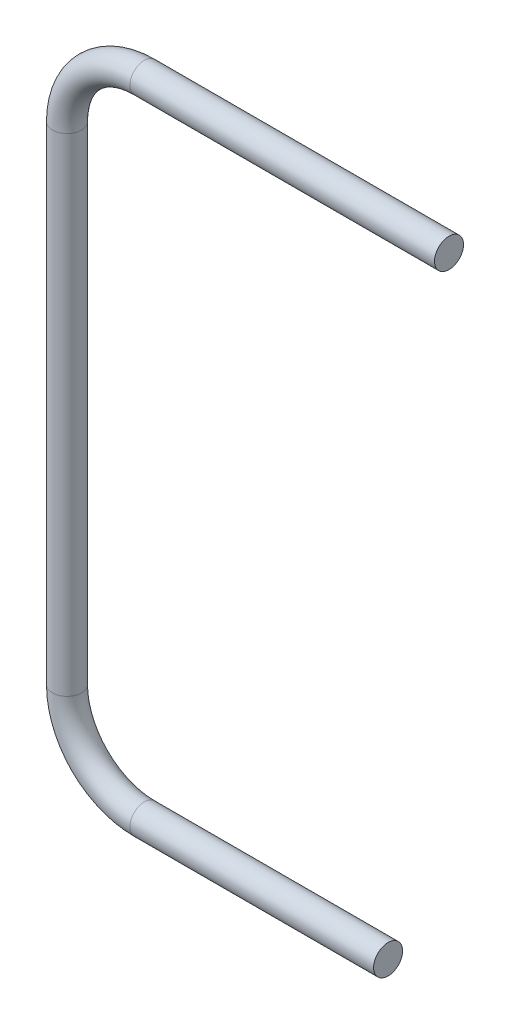
ISO-10303-21;
HEADER;
FILE_DESCRIPTION(('STEP AP214'),'2;1');
FILE_NAME('part.step','',(''),(''),'','','');
FILE_SCHEMA(('AUTOMOTIVE_DESIGN { 1 0 10303 214 1 1 1 1 }'));
ENDSEC;
DATA;
#1=APPLICATION_CONTEXT('core data for automotive mechanical design processes');
#2=APPLICATION_PROTOCOL_DEFINITION('international standard','automotive_design',2000,#1);
#3=PRODUCT_CONTEXT('',#1,'mechanical');
#4=PRODUCT('Part','Part','',(#3));
#5=PRODUCT_RELATED_PRODUCT_CATEGORY('part','',(#4));
#6=PRODUCT_DEFINITION_FORMATION('','',#4);
#7=PRODUCT_DEFINITION_CONTEXT('part definition',#1,'design');
#8=PRODUCT_DEFINITION('design','',#6,#7);
#9=PRODUCT_DEFINITION_SHAPE('','',#8);
#10=(LENGTH_UNIT() NAMED_UNIT(*) SI_UNIT(.MILLI.,.METRE.));
#11=(NAMED_UNIT(*) PLANE_ANGLE_UNIT() SI_UNIT($,.RADIAN.));
#12=(NAMED_UNIT(*) SI_UNIT($,.STERADIAN.) SOLID_ANGLE_UNIT());
#13=UNCERTAINTY_MEASURE_WITH_UNIT(LENGTH_MEASURE(1.E-05),#10,'distance_accuracy_value','');
#14=(GEOMETRIC_REPRESENTATION_CONTEXT(3) GLOBAL_UNCERTAINTY_ASSIGNED_CONTEXT((#13)) GLOBAL_UNIT_ASSIGNED_CONTEXT((#10,
#11,#12)) REPRESENTATION_CONTEXT('',''));
#15=CARTESIAN_POINT('',(0.,0.,0.));
#16=DIRECTION('',(0.,0.,1.));
#17=DIRECTION('',(1.,0.,0.));
#18=AXIS2_PLACEMENT_3D('',#15,#16,#17);
#19=CARTESIAN_POINT('',(0.,0.,0.));
#20=DIRECTION('',(1.,0.,0.));
#21=DIRECTION('',(0.,0.,1.));
#22=AXIS2_PLACEMENT_3D('',#19,#20,#21);
#23=PLANE('',#22);
#24=CARTESIAN_POINT('',(0.,0.,0.));
#25=DIRECTION('',(1.,0.,0.));
#26=DIRECTION('',(0.,0.,1.));
#27=AXIS2_PLACEMENT_3D('',#24,#25,#26);
#28=CIRCLE('',#27,2.38125);
#29=CARTESIAN_POINT('',(0.,0.,2.38125));
#30=VERTEX_POINT('',#29);
#31=EDGE_CURVE('E76',#30,#30,#28,.T.);
#32=ORIENTED_EDGE('',*,*,#31,.T.);
#33=EDGE_LOOP('',(#32));
#34=FACE_BOUND('',#33,.T.);
#35=ADVANCED_FACE('F49',(#34),#23,.T.);
#36=CARTESIAN_POINT('',(9.99999999999999,105.4,0.));
#37=DIRECTION('',(-1.,0.,0.));
#38=DIRECTION('',(0.,0.,1.));
#39=AXIS2_PLACEMENT_3D('',#36,#37,#38);
#40=PLANE('',#39);
#41=CARTESIAN_POINT('',(9.99999999999999,105.4,0.));
#42=DIRECTION('',(-1.,0.,0.));
#43=DIRECTION('',(0.,0.,1.));
#44=AXIS2_PLACEMENT_3D('',#41,#42,#43);
#45=CIRCLE('',#44,2.38125);
#46=CARTESIAN_POINT('',(9.99999999999999,105.4,2.38125));
#47=VERTEX_POINT('',#46);
#48=EDGE_CURVE('E11',#47,#47,#45,.T.);
#49=ORIENTED_EDGE('',*,*,#48,.F.);
#50=EDGE_LOOP('',(#49));
#51=FACE_BOUND('',#50,.T.);
#52=ADVANCED_FACE('F85',(#51),#40,.F.);
#53=CARTESIAN_POINT('',(0.,0.,0.));
#54=DIRECTION('',(-1.,0.,0.));
#55=DIRECTION('',(0.,-1.,0.));
#56=AXIS2_PLACEMENT_3D('',#53,#54,#55);
#57=CYLINDRICAL_SURFACE('',#56,2.38125);
#58=CARTESIAN_POINT('',(-40.,0.,0.));
#59=DIRECTION('',(1.,0.,0.));
#60=DIRECTION('',(0.,0.,1.));
#61=AXIS2_PLACEMENT_3D('',#58,#59,#60);
#62=CIRCLE('',#61,2.38125);
#63=CARTESIAN_POINT('',(-40.,-2.38125000000001,0.));
#64=VERTEX_POINT('',#63);
#65=EDGE_CURVE('E72',#64,#64,#62,.T.);
#66=ORIENTED_EDGE('',*,*,#65,.T.);
#67=EDGE_LOOP('',(#66));
#68=FACE_BOUND('',#67,.T.);
#69=ORIENTED_EDGE('',*,*,#31,.F.);
#70=EDGE_LOOP('',(#69));
#71=FACE_BOUND('',#70,.T.);
#72=ADVANCED_FACE('F82',(#68,#71),#57,.T.);
#73=CARTESIAN_POINT('',(-40.,12.7,0.));
#74=DIRECTION('',(0.,0.,-1.));
#75=DIRECTION('',(-1.,0.,0.));
#76=AXIS2_PLACEMENT_3D('',#73,#74,#75);
#77=TOROIDAL_SURFACE('',#76,12.7,2.38125);
#78=CARTESIAN_POINT('',(-52.7,12.7,0.));
#79=DIRECTION('',(0.,-1.,0.));
#80=DIRECTION('',(0.,0.,1.));
#81=AXIS2_PLACEMENT_3D('',#78,#79,#80);
#82=CIRCLE('',#81,2.38125);
#83=CARTESIAN_POINT('',(-55.08125,12.7,0.));
#84=VERTEX_POINT('',#83);
#85=EDGE_CURVE('E66',#84,#84,#82,.T.);
#86=CARTESIAN_POINT('',(-40.,12.7,0.));
#87=DIRECTION('',(0.,0.,-1.));
#88=DIRECTION('',(-1.,0.,0.));
#89=AXIS2_PLACEMENT_3D('',#86,#87,#88);
#90=CIRCLE('',#89,15.08125);
#91=EDGE_CURVE('',#64,#84,#90,.T.);
#92=ORIENTED_EDGE('',*,*,#65,.F.);
#93=ORIENTED_EDGE('',*,*,#85,.T.);
#94=ORIENTED_EDGE('',*,*,#91,.T.);
#95=ORIENTED_EDGE('',*,*,#91,.F.);
#96=EDGE_LOOP('',(#92,#94,#93,#95));
#97=FACE_BOUND('',#96,.T.);
#98=ADVANCED_FACE('F84',(#97),#77,.T.);
#99=CARTESIAN_POINT('',(-52.7,12.7,0.));
#100=DIRECTION('',(0.,1.,0.));
#101=DIRECTION('',(-1.,0.,0.));
#102=AXIS2_PLACEMENT_3D('',#99,#100,#101);
#103=CYLINDRICAL_SURFACE('',#102,2.38125);
#104=CARTESIAN_POINT('',(-52.7,92.7,0.));
#105=DIRECTION('',(0.,-1.,0.));
#106=DIRECTION('',(0.,0.,1.));
#107=AXIS2_PLACEMENT_3D('',#104,#105,#106);
#108=CIRCLE('',#107,2.38125);
#109=CARTESIAN_POINT('',(-55.08125,92.7,0.));
#110=VERTEX_POINT('',#109);
#111=EDGE_CURVE('E61',#110,#110,#108,.T.);
#112=ORIENTED_EDGE('',*,*,#111,.T.);
#113=EDGE_LOOP('',(#112));
#114=FACE_BOUND('',#113,.T.);
#115=ORIENTED_EDGE('',*,*,#85,.F.);
#116=EDGE_LOOP('',(#115));
#117=FACE_BOUND('',#116,.T.);
#118=ADVANCED_FACE('F92',(#114,#117),#103,.T.);
#119=CARTESIAN_POINT('',(-40.,92.7,0.));
#120=DIRECTION('',(0.,0.,-1.));
#121=DIRECTION('',(-1.,0.,0.));
#122=AXIS2_PLACEMENT_3D('',#119,#120,#121);
#123=TOROIDAL_SURFACE('',#122,12.7,2.38125);
#124=CARTESIAN_POINT('',(-40.,105.4,0.));
#125=DIRECTION('',(-1.,0.,0.));
#126=DIRECTION('',(0.,0.,1.));
#127=AXIS2_PLACEMENT_3D('',#124,#125,#126);
#128=CIRCLE('',#127,2.38125);
#129=CARTESIAN_POINT('',(-40.,107.78125,0.));
#130=VERTEX_POINT('',#129);
#131=EDGE_CURVE('E56',#130,#130,#128,.T.);
#132=CARTESIAN_POINT('',(-40.,92.7,0.));
#133=DIRECTION('',(0.,0.,-1.));
#134=DIRECTION('',(-1.,0.,0.));
#135=AXIS2_PLACEMENT_3D('',#132,#133,#134);
#136=CIRCLE('',#135,15.08125);
#137=EDGE_CURVE('',#110,#130,#136,.T.);
#138=ORIENTED_EDGE('',*,*,#111,.F.);
#139=ORIENTED_EDGE('',*,*,#131,.T.);
#140=ORIENTED_EDGE('',*,*,#137,.T.);
#141=ORIENTED_EDGE('',*,*,#137,.F.);
#142=EDGE_LOOP('',(#138,#140,#139,#141));
#143=FACE_BOUND('',#142,.T.);
#144=ADVANCED_FACE('F98',(#143),#123,.T.);
#145=CARTESIAN_POINT('',(-40.,105.4,0.));
#146=DIRECTION('',(1.,0.,0.));
#147=DIRECTION('',(0.,0.,-1.));
#148=AXIS2_PLACEMENT_3D('',#145,#146,#147);
#149=CYLINDRICAL_SURFACE('',#148,2.38125);
#150=ORIENTED_EDGE('',*,*,#48,.T.);
#151=EDGE_LOOP('',(#150));
#152=FACE_BOUND('',#151,.T.);
#153=ORIENTED_EDGE('',*,*,#131,.F.);
#154=EDGE_LOOP('',(#153));
#155=FACE_BOUND('',#154,.T.);
#156=ADVANCED_FACE('F96',(#152,#155),#149,.T.);
#157=CLOSED_SHELL('',(#35,#52,#72,#98,#118,#144,#156));
#158=MANIFOLD_SOLID_BREP('B2',#157);
#159=ADVANCED_BREP_SHAPE_REPRESENTATION('',(#18,#158),#14);
#160=SHAPE_DEFINITION_REPRESENTATION(#9,#159);
ENDSEC;
END-ISO-10303-21;
